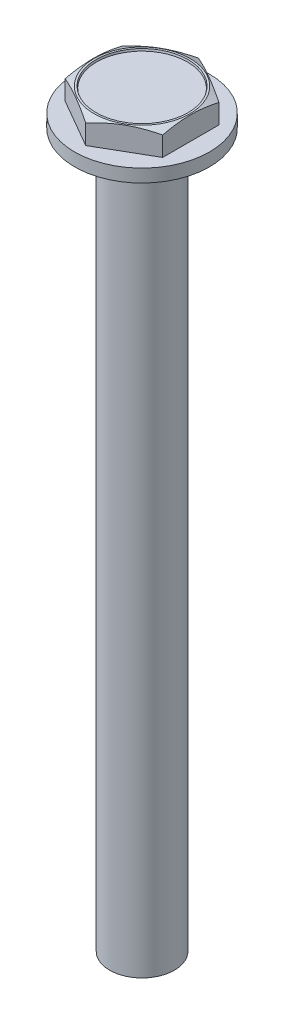
ISO-10303-21;
HEADER;
FILE_DESCRIPTION(('STEP AP214'),'2;1');
FILE_NAME('part.step','',(''),(''),'','','');
FILE_SCHEMA(('AUTOMOTIVE_DESIGN { 1 0 10303 214 1 1 1 1 }'));
ENDSEC;
DATA;
#1=APPLICATION_CONTEXT('core data for automotive mechanical design processes');
#2=APPLICATION_PROTOCOL_DEFINITION('international standard','automotive_design',2000,#1);
#3=PRODUCT_CONTEXT('',#1,'mechanical');
#4=PRODUCT('Part','Part','',(#3));
#5=PRODUCT_RELATED_PRODUCT_CATEGORY('part','',(#4));
#6=PRODUCT_DEFINITION_FORMATION('','',#4);
#7=PRODUCT_DEFINITION_CONTEXT('part definition',#1,'design');
#8=PRODUCT_DEFINITION('design','',#6,#7);
#9=PRODUCT_DEFINITION_SHAPE('','',#8);
#10=(LENGTH_UNIT() NAMED_UNIT(*) SI_UNIT(.MILLI.,.METRE.));
#11=(NAMED_UNIT(*) PLANE_ANGLE_UNIT() SI_UNIT($,.RADIAN.));
#12=(NAMED_UNIT(*) SI_UNIT($,.STERADIAN.) SOLID_ANGLE_UNIT());
#13=UNCERTAINTY_MEASURE_WITH_UNIT(LENGTH_MEASURE(1.E-05),#10,'distance_accuracy_value','');
#14=(GEOMETRIC_REPRESENTATION_CONTEXT(3) GLOBAL_UNCERTAINTY_ASSIGNED_CONTEXT((#13)) GLOBAL_UNIT_ASSIGNED_CONTEXT((#10,
#11,#12)) REPRESENTATION_CONTEXT('',''));
#15=CARTESIAN_POINT('',(0.,0.,0.));
#16=DIRECTION('',(0.,0.,1.));
#17=DIRECTION('',(1.,0.,0.));
#18=AXIS2_PLACEMENT_3D('',#15,#16,#17);
#19=CARTESIAN_POINT('',(0.,0.,0.));
#20=DIRECTION('',(0.,-1.,0.));
#21=DIRECTION('',(0.,0.,-1.));
#22=AXIS2_PLACEMENT_3D('',#19,#20,#21);
#23=CYLINDRICAL_SURFACE('',#22,3.30199714);
#24=CARTESIAN_POINT('',(0.,0.,0.));
#25=DIRECTION('',(0.,-1.,0.));
#26=DIRECTION('',(0.,0.,-1.));
#27=AXIS2_PLACEMENT_3D('',#24,#25,#26);
#28=CIRCLE('',#27,3.30199714);
#29=CARTESIAN_POINT('',(0.,0.,-3.30199714));
#30=VERTEX_POINT('',#29);
#31=EDGE_CURVE('E139',#30,#30,#28,.T.);
#32=ORIENTED_EDGE('',*,*,#31,.F.);
#33=EDGE_LOOP('',(#32));
#34=FACE_BOUND('',#33,.T.);
#35=CARTESIAN_POINT('',(0.,0.63499945,0.));
#36=DIRECTION('',(0.,1.,0.));
#37=DIRECTION('',(0.,0.,1.));
#38=AXIS2_PLACEMENT_3D('',#35,#36,#37);
#39=CIRCLE('',#38,3.30199714);
#40=CARTESIAN_POINT('',(0.,0.63499945,3.30199714));
#41=VERTEX_POINT('',#40);
#42=EDGE_CURVE('E38',#41,#41,#39,.F.);
#43=ORIENTED_EDGE('',*,*,#42,.T.);
#44=EDGE_LOOP('',(#43));
#45=FACE_BOUND('',#44,.T.);
#46=ADVANCED_FACE('F34',(#34,#45),#23,.T.);
#47=CARTESIAN_POINT('',(0.,0.,0.));
#48=DIRECTION('',(0.,-1.,0.));
#49=DIRECTION('',(0.,0.,-1.));
#50=AXIS2_PLACEMENT_3D('',#47,#48,#49);
#51=PLANE('',#50);
#52=CARTESIAN_POINT('',(0.,0.,0.));
#53=DIRECTION('',(0.,-1.,0.));
#54=DIRECTION('',(0.,0.,-1.));
#55=AXIS2_PLACEMENT_3D('',#52,#53,#54);
#56=CIRCLE('',#55,1.587498625);
#57=CARTESIAN_POINT('',(0.,0.,-1.587498625));
#58=VERTEX_POINT('',#57);
#59=EDGE_CURVE('E142',#58,#58,#56,.T.);
#60=ORIENTED_EDGE('',*,*,#59,.F.);
#61=EDGE_LOOP('',(#60));
#62=FACE_BOUND('',#61,.T.);
#63=ORIENTED_EDGE('',*,*,#31,.T.);
#64=EDGE_LOOP('',(#63));
#65=FACE_BOUND('',#64,.T.);
#66=ADVANCED_FACE('F36',(#62,#65),#51,.T.);
#67=CARTESIAN_POINT('',(0.,-34.925,0.));
#68=DIRECTION('',(0.,-1.,0.));
#69=DIRECTION('',(0.,0.,-1.));
#70=AXIS2_PLACEMENT_3D('',#67,#68,#69);
#71=PLANE('',#70);
#72=CARTESIAN_POINT('',(0.,-34.925,0.));
#73=DIRECTION('',(0.,-1.,0.));
#74=DIRECTION('',(0.,0.,-1.));
#75=AXIS2_PLACEMENT_3D('',#72,#73,#74);
#76=CIRCLE('',#75,1.587498625);
#77=CARTESIAN_POINT('',(0.,-34.925,-1.587498625));
#78=VERTEX_POINT('',#77);
#79=EDGE_CURVE('E127',#78,#78,#76,.T.);
#80=ORIENTED_EDGE('',*,*,#79,.T.);
#81=EDGE_LOOP('',(#80));
#82=FACE_BOUND('',#81,.T.);
#83=ADVANCED_FACE('F222',(#82),#71,.T.);
#84=CARTESIAN_POINT('',(0.,0.,0.));
#85=DIRECTION('',(0.,-1.,0.));
#86=DIRECTION('',(0.,0.,-1.));
#87=AXIS2_PLACEMENT_3D('',#84,#85,#86);
#88=CYLINDRICAL_SURFACE('',#87,1.587498625);
#89=ORIENTED_EDGE('',*,*,#59,.T.);
#90=EDGE_LOOP('',(#89));
#91=FACE_BOUND('',#90,.T.);
#92=ORIENTED_EDGE('',*,*,#79,.F.);
#93=EDGE_LOOP('',(#92));
#94=FACE_BOUND('',#93,.T.);
#95=ADVANCED_FACE('F230',(#91,#94),#88,.T.);
#96=CARTESIAN_POINT('',(-3.632196854,0.63499945,3.632196854));
#97=DIRECTION('',(0.,1.,0.));
#98=DIRECTION('',(0.,0.,1.));
#99=AXIS2_PLACEMENT_3D('',#96,#97,#98);
#100=PLANE('',#99);
#101=ORIENTED_EDGE('',*,*,#42,.F.);
#102=EDGE_LOOP('',(#101));
#103=FACE_BOUND('',#102,.T.);
#104=DIRECTION('',(-0.866025781775686,0.,0.499999345299384));
#105=VECTOR('',#104,1.);
#106=CARTESIAN_POINT('',(1.87579371350743E-06,0.63499945,-2.75696049718073));
#107=LINE('',#106,#105);
#108=CARTESIAN_POINT('',(1.87579371350743E-06,0.63499945,-2.75696049718073));
#109=VERTEX_POINT('',#108);
#110=CARTESIAN_POINT('',(-2.38759668147004,0.63499945,-1.37848223407189));
#111=VERTEX_POINT('',#110);
#112=EDGE_CURVE('E92',#109,#111,#107,.T.);
#113=ORIENTED_EDGE('',*,*,#112,.F.);
#114=DIRECTION('',(-0.866025101391085,0.,-0.500000523760287));
#115=VECTOR('',#114,1.);
#116=CARTESIAN_POINT('',(2.38759855726424,0.63499945,-1.37847898510215));
#117=LINE('',#116,#115);
#118=CARTESIAN_POINT('',(2.38759855726424,0.63499945,-1.37847898510215));
#119=VERTEX_POINT('',#118);
#120=EDGE_CURVE('E112',#119,#109,#117,.T.);
#121=ORIENTED_EDGE('',*,*,#120,.F.);
#122=DIRECTION('',(4.53589793386286E-07,0.,-0.999999999999897));
#123=VECTOR('',#122,1.);
#124=CARTESIAN_POINT('',(2.38759730673527,0.63499945,1.37848115108226));
#125=LINE('',#124,#123);
#126=CARTESIAN_POINT('',(2.38759730673527,0.63499945,1.37848115108226));
#127=VERTEX_POINT('',#126);
#128=EDGE_CURVE('E109',#127,#119,#125,.T.);
#129=ORIENTED_EDGE('',*,*,#128,.F.);
#130=DIRECTION('',(0.866025554980997,0.,-0.499999738119788));
#131=VECTOR('',#130,1.);
#132=CARTESIAN_POINT('',(-6.25264571169187E-07,0.63499945,2.7569604971813));
#133=LINE('',#132,#131);
#134=CARTESIAN_POINT('',(-6.25264571455647E-07,0.63499945,2.7569604971813));
#135=VERTEX_POINT('',#134);
#136=EDGE_CURVE('E102',#135,#127,#133,.T.);
#137=ORIENTED_EDGE('',*,*,#136,.F.);
#138=DIRECTION('',(0.86602532818613,0.,0.500000130940089));
#139=VECTOR('',#138,1.);
#140=CARTESIAN_POINT('',(-2.387597932,0.63499945,1.37848006809235));
#141=LINE('',#140,#139);
#142=CARTESIAN_POINT('',(-2.387597932,0.63499945,1.37848006809235));
#143=VERTEX_POINT('',#142);
#144=EDGE_CURVE('E88',#143,#135,#141,.T.);
#145=ORIENTED_EDGE('',*,*,#144,.F.);
#146=DIRECTION('',(-4.53589793478602E-07,0.,0.999999999999897));
#147=VECTOR('',#146,1.);
#148=CARTESIAN_POINT('',(-2.38759668147004,0.63499945,-1.37848223407189));
#149=LINE('',#148,#147);
#150=EDGE_CURVE('E98',#111,#143,#149,.T.);
#151=ORIENTED_EDGE('',*,*,#150,.F.);
#152=EDGE_LOOP('',(#113,#121,#129,#137,#145,#151));
#153=FACE_BOUND('',#152,.T.);
#154=ADVANCED_FACE('F97',(#103,#153),#100,.T.);
#155=CARTESIAN_POINT('',(-2.38759668147004,0.63499945,-1.37848223407189));
#156=DIRECTION('',(-0.999999999999897,0.,-4.53589793478602E-07));
#157=DIRECTION('',(-4.53589793478602E-07,0.,0.999999999999897));
#158=AXIS2_PLACEMENT_3D('',#155,#156,#157);
#159=PLANE('',#158);
#160=DIRECTION('',(0.,1.,0.));
#161=VECTOR('',#160,1.);
#162=CARTESIAN_POINT('',(-2.38759668147004,0.63499945,-1.37848223407189));
#163=LINE('',#162,#161);
#164=CARTESIAN_POINT('',(-2.38759668147004,1.58662449949913,-1.37848223407189));
#165=VERTEX_POINT('',#164);
#166=EDGE_CURVE('E105',#111,#165,#163,.T.);
#167=ORIENTED_EDGE('',*,*,#166,.F.);
#168=ORIENTED_EDGE('',*,*,#150,.T.);
#169=DIRECTION('',(0.,1.,0.));
#170=VECTOR('',#169,1.);
#171=CARTESIAN_POINT('',(-2.387597932,0.63499945,1.37848006809235));
#172=LINE('',#171,#170);
#173=CARTESIAN_POINT('',(-2.387597932,1.58662449949913,1.37848006809235));
#174=VERTEX_POINT('',#173);
#175=EDGE_CURVE('E85',#143,#174,#172,.T.);
#176=ORIENTED_EDGE('',*,*,#175,.T.);
#177=CARTESIAN_POINT('',(-2.38759563665717,0.82592264979571,-3.68191339705671));
#178=CARTESIAN_POINT('',(-2.38759568546214,0.868007597429517,-3.5743162616899));
#179=CARTESIAN_POINT('',(-2.38759573434887,0.909640002661534,-3.46653884254628));
#180=CARTESIAN_POINT('',(-2.3875958323293,0.991743240631232,-3.25052774865804));
#181=CARTESIAN_POINT('',(-2.38759588142302,1.03221392910879,-3.14229401914703));
#182=CARTESIAN_POINT('',(-2.38759598001059,1.11185744720428,-2.92494439563767));
#183=CARTESIAN_POINT('',(-2.38759602950523,1.15102557118968,-2.81582677110998));
#184=CARTESIAN_POINT('',(-2.38759612877967,1.22755881357541,-2.59696285041737));
#185=CARTESIAN_POINT('',(-2.38759617855946,1.26492399306196,-2.48721657569312));
#186=CARTESIAN_POINT('',(-2.3875962778013,1.33690696514371,-2.26842452247645));
#187=CARTESIAN_POINT('',(-2.38759632725889,1.37155447567986,-2.15938857346456));
#188=CARTESIAN_POINT('',(-2.38759642656425,1.43805781322599,-1.94045649993622));
#189=CARTESIAN_POINT('',(-2.38759647641203,1.4699134769258,-1.83056032550962));
#190=CARTESIAN_POINT('',(-2.38759657650195,1.53006082711025,-1.60989856513628));
#191=CARTESIAN_POINT('',(-2.38759662674367,1.55835590678975,-1.49913391545499));
#192=CARTESIAN_POINT('',(-2.38759672769469,1.6105119210806,-1.27657374347072));
#193=CARTESIAN_POINT('',(-2.38759677840395,1.63437327216478,-1.16477831902787));
#194=CARTESIAN_POINT('',(-2.38759689899839,1.68436690936316,-0.898911587805904));
#195=CARTESIAN_POINT('',(-2.38759696909722,1.70812390586332,-0.744369240665296));
#196=CARTESIAN_POINT('',(-2.38759707471041,1.73414034801435,-0.511530696671798));
#197=CARTESIAN_POINT('',(-2.38759710998718,1.74120899454148,-0.433758274471886));
#198=CARTESIAN_POINT('',(-2.38759718064665,1.7519158654777,-0.277979943075556));
#199=CARTESIAN_POINT('',(-2.38759721602932,1.75555444989828,-0.199974059245071));
#200=CARTESIAN_POINT('',(-2.3875972869901,1.75927506300815,-0.0435314223952808));
#201=CARTESIAN_POINT('',(-2.38759732256838,1.75934126407512,0.0349057084680099));
#202=CARTESIAN_POINT('',(-2.3875973936858,1.75587572541089,0.191693659234515));
#203=CARTESIAN_POINT('',(-2.38759742922493,1.75234425093585,0.270044485074635));
#204=CARTESIAN_POINT('',(-2.38759750020373,1.74181206550032,0.426526839189364));
#205=CARTESIAN_POINT('',(-2.38759753564337,1.73481064873104,0.504658319594741));
#206=CARTESIAN_POINT('',(-2.38759760635608,1.71757822791918,0.660554029373964));
#207=CARTESIAN_POINT('',(-2.38759764162914,1.70734734986413,0.738318272954332));
#208=CARTESIAN_POINT('',(-2.38759777439104,1.6632145614196,1.03100981198254));
#209=CARTESIAN_POINT('',(-2.38759787122391,1.61952154135123,1.24449097192338));
#210=CARTESIAN_POINT('',(-2.38759801516718,1.54248199940457,1.56183336117531));
#211=CARTESIAN_POINT('',(-2.38759806296355,1.51486214545272,1.66720691646555));
#212=CARTESIAN_POINT('',(-2.38759815816755,1.45652585719684,1.87709700690655));
#213=CARTESIAN_POINT('',(-2.38759820557521,1.42580963221185,1.98161359947336));
#214=CARTESIAN_POINT('',(-2.38759834783867,1.32960807049972,2.29525260864042));
#215=CARTESIAN_POINT('',(-2.38759844217066,1.26038803903867,2.50322024099262));
#216=CARTESIAN_POINT('',(-2.38759862976457,1.11566696135706,2.91679636358055));
#217=CARTESIAN_POINT('',(-2.387598723027,1.04016911205442,3.12240599463384));
#218=CARTESIAN_POINT('',(-2.38759890923104,0.884641775771132,3.53291795747265));
#219=CARTESIAN_POINT('',(-2.38759900216949,0.804594015180208,3.73781332855943));
#220=CARTESIAN_POINT('',(-2.38759918753323,0.641592906706982,4.14647276155014));
#221=CARTESIAN_POINT('',(-2.38759927995846,0.558639140974642,4.35023665584037));
#222=CARTESIAN_POINT('',(-2.3875994631779,0.391826332829074,4.75416868898633));
#223=CARTESIAN_POINT('',(-2.38759955397728,0.307994707214035,4.95434818767171));
#224=CARTESIAN_POINT('',(-2.38759973526957,0.138862739464773,5.35403153605404));
#225=CARTESIAN_POINT('',(-2.38759982576255,0.0535627437790748,5.55353553218854));
#226=CARTESIAN_POINT('',(-2.38759991615683,-0.0322324060214044,5.75282195545422));
#227=B_SPLINE_CURVE_WITH_KNOTS('',3,(#177,#178,#179,#180,#181,#182,#183,#184,#185,#186,#187,
#188,#189,#190,#191,#192,#193,#194,#195,#196,#197,#198,#199,#200,#201,#202,#203,#204,#205,#206,
#207,#208,#209,#210,#211,#212,#213,#214,#215,#216,#217,#218,#219,#220,#221,#222,#223,#224,#225,
#226),.UNSPECIFIED.,.F.,.F.,(4,2,2,2,2,2,2,2,2,2,2,2,2,2,2,2,2,2,2,2,2,2,2,2,4),(0.,
0.346607897833493,0.693258652299566,1.04104935984361,1.38882827547449,1.73202382477045,
2.07523943604303,2.4181254491265,2.76097923764438,3.22954472428704,3.46376008296962,
3.69795085620414,3.93317913851899,4.16839007873801,4.40364888203637,4.63889850856751,
5.29155455526913,5.61833976804775,5.94510290448223,6.60247648387668,7.25951732856589,
7.91941453657583,8.57940702283087,9.23047341215962,9.88138823841751),.UNSPECIFIED.);
#228=EDGE_CURVE('E11',#165,#174,#227,.T.);
#229=ORIENTED_EDGE('',*,*,#228,.F.);
#230=EDGE_LOOP('',(#167,#168,#176,#229));
#231=FACE_BOUND('',#230,.T.);
#232=ADVANCED_FACE('F104',(#231),#159,.T.);
#233=CARTESIAN_POINT('',(1.87579371350743E-06,0.63499945,-2.75696049718073));
#234=DIRECTION('',(-0.499999345299384,0.,-0.866025781775686));
#235=DIRECTION('',(-0.866025781775686,0.,0.499999345299384));
#236=AXIS2_PLACEMENT_3D('',#233,#234,#235);
#237=PLANE('',#236);
#238=DIRECTION('',(0.,1.,0.));
#239=VECTOR('',#238,1.);
#240=CARTESIAN_POINT('',(1.87579371350743E-06,0.63499945,-2.75696049718073));
#241=LINE('',#240,#239);
#242=CARTESIAN_POINT('',(1.87579371350743E-06,1.58662449949913,-2.75696049718073));
#243=VERTEX_POINT('',#242);
#244=EDGE_CURVE('E117',#109,#243,#241,.T.);
#245=ORIENTED_EDGE('',*,*,#244,.F.);
#246=ORIENTED_EDGE('',*,*,#112,.T.);
#247=ORIENTED_EDGE('',*,*,#166,.T.);
#248=CARTESIAN_POINT('',(0.000201875793713451,1.58657065158552,-2.75707596703298));
#249=CARTESIAN_POINT('',(-0.0720066957215331,1.60601236066919,-2.71538640161542));
#250=CARTESIAN_POINT('',(-0.144481711809998,1.62420572203027,-2.67354300462036));
#251=CARTESIAN_POINT('',(-0.289975655389969,1.65766237612313,-2.58954218378354));
#252=CARTESIAN_POINT('',(-0.362994855127122,1.67292408342063,-2.54738460276095));
#253=CARTESIAN_POINT('',(-0.509578901999248,1.70007484817584,-2.46275441159375));
#254=CARTESIAN_POINT('',(-0.583144196375563,1.71196073140966,-2.42028154323469));
#255=CARTESIAN_POINT('',(-0.73065200191862,1.73192108675075,-2.33511802068129));
#256=CARTESIAN_POINT('',(-0.804594439774827,1.73999627304312,-2.29242740881274));
#257=CARTESIAN_POINT('',(-0.951197719183179,1.75188911899834,-2.20778611375496));
#258=CARTESIAN_POINT('',(-1.02385333963283,1.75579159580006,-2.1658384449654));
#259=CARTESIAN_POINT('',(-1.16924844741729,1.7594692707652,-2.0818946869021));
#260=CARTESIAN_POINT('',(-1.24198793948803,1.75924422317287,-2.03989859489406));
#261=CARTESIAN_POINT('',(-1.38729615050964,1.75467833848675,-1.95600500661259));
#262=CARTESIAN_POINT('',(-1.45986496726674,1.75034158131286,-1.91410745387079));
#263=CARTESIAN_POINT('',(-1.60474605864116,1.73773860060795,-1.83046046280208));
#264=CARTESIAN_POINT('',(-1.67705832618673,1.72947226959368,-1.78871102855803));
#265=CARTESIAN_POINT('',(-1.80267576563598,1.7119279729979,-1.71618589269656));
#266=CARTESIAN_POINT('',(-1.85606796506129,1.70346223157425,-1.68535994580384));
#267=CARTESIAN_POINT('',(-1.96260822142988,1.68470190826843,-1.62384900750002));
#268=CARTESIAN_POINT('',(-2.01575628840245,1.67440740221637,-1.59316401029851));
#269=CARTESIAN_POINT('',(-2.12221905586089,1.65206814140025,-1.53169781015972));
#270=CARTESIAN_POINT('',(-2.17553161334615,1.6400098720831,-1.50091784448225));
#271=CARTESIAN_POINT('',(-2.28187473587065,1.61438127027717,-1.43952072125767));
#272=CARTESIAN_POINT('',(-2.3349053466602,1.60081119146804,-1.40890353729666));
#273=CARTESIAN_POINT('',(-2.38779668147004,1.58657065158552,-1.37836676421964));
#274=B_SPLINE_CURVE_WITH_KNOTS('',3,(#248,#249,#250,#251,#252,#253,#254,#255,#256,#257,#258,
#259,#260,#261,#262,#263,#264,#265,#266,#267,#268,#269,#270,#271,#272,#273),.UNSPECIFIED.,.F.,
.F.,(4,2,2,2,2,2,2,2,2,2,2,2,4),(0.,0.256862209525977,0.513862941083679,0.771104531568585,
1.02829789172992,1.28015774621717,1.53203259666787,1.78365778091964,2.03528984811856,
2.22195401160986,2.40861043683876,2.59678030701215,2.78491864994954),.UNSPECIFIED.);
#275=EDGE_CURVE('E43',#243,#165,#274,.T.);
#276=ORIENTED_EDGE('',*,*,#275,.F.);
#277=EDGE_LOOP('',(#245,#246,#247,#276));
#278=FACE_BOUND('',#277,.T.);
#279=ADVANCED_FACE('F172',(#278),#237,.T.);
#280=CARTESIAN_POINT('',(2.38759855726424,0.63499945,-1.37847898510215));
#281=DIRECTION('',(0.500000523760287,0.,-0.866025101391084));
#282=DIRECTION('',(-0.866025101391085,0.,-0.500000523760287));
#283=AXIS2_PLACEMENT_3D('',#280,#281,#282);
#284=PLANE('',#283);
#285=DIRECTION('',(0.,1.,0.));
#286=VECTOR('',#285,1.);
#287=CARTESIAN_POINT('',(2.38759855726424,0.63499945,-1.37847898510215));
#288=LINE('',#287,#286);
#289=CARTESIAN_POINT('',(2.38759855726424,1.58662449949913,-1.37847898510215));
#290=VERTEX_POINT('',#289);
#291=EDGE_CURVE('E120',#119,#290,#288,.T.);
#292=ORIENTED_EDGE('',*,*,#291,.F.);
#293=ORIENTED_EDGE('',*,*,#120,.T.);
#294=ORIENTED_EDGE('',*,*,#244,.T.);
#295=CARTESIAN_POINT('',(2.38779855726424,1.58657065154321,-1.37836351488704));
#296=CARTESIAN_POINT('',(2.31559004247528,1.60601236062979,-1.42005317856589));
#297=CARTESIAN_POINT('',(2.24311508332241,1.62420572199378,-1.46189667418482));
#298=CARTESIAN_POINT('',(2.09762125404086,1.65766237609246,-1.54589769300958));
#299=CARTESIAN_POINT('',(2.02460211166675,1.67292408339284,-1.58805537339659));
#300=CARTESIAN_POINT('',(1.87801817994925,1.70007484815373,-1.67268576403523));
#301=CARTESIAN_POINT('',(1.80445294336486,1.71196073139035,-1.71515873250192));
#302=CARTESIAN_POINT('',(1.65694525370191,1.73192108673679,-1.80032245578393));
#303=CARTESIAN_POINT('',(1.58300287393383,1.73999627303172,-1.84301316827337));
#304=CARTESIAN_POINT('',(1.43639970969507,1.75188911899167,-1.92765466282884));
#305=CARTESIAN_POINT('',(1.36374414632279,1.75579159579557,-1.9696024304881));
#306=CARTESIAN_POINT('',(1.21834915275887,1.75946927076465,-2.05354638640497));
#307=CARTESIAN_POINT('',(1.1456097178313,1.7592442231741,-2.09554257739689));
#308=CARTESIAN_POINT('',(1.00030162096183,1.75467833849104,-2.17943636341376));
#309=CARTESIAN_POINT('',(0.927732861213782,1.75034158131844,-2.22133401490721));
#310=CARTESIAN_POINT('',(0.782851883655894,1.73773860061561,-2.30498120313014));
#311=CARTESIAN_POINT('',(0.710539672917795,1.72947226960212,-2.34673073577676));
#312=CARTESIAN_POINT('',(0.584922332136081,1.71192797300508,-2.41925604258754));
#313=CARTESIAN_POINT('',(0.531530174639281,1.70346223157892,-2.45008206214542));
#314=CARTESIAN_POINT('',(0.424990001936059,1.6847019082668,-2.51159314544722));
#315=CARTESIAN_POINT('',(0.371841976700345,1.67440740221095,-2.54227821498158));
#316=CARTESIAN_POINT('',(0.265379292846402,1.65206814138607,-2.60374456001291));
#317=CARTESIAN_POINT('',(0.212066777227084,1.64000987206394,-2.63452459824716));
#318=CARTESIAN_POINT('',(0.105723738213136,1.6143812702471,-2.69592186620143));
#319=CARTESIAN_POINT('',(0.0526931690682303,1.60081119143204,-2.72653912233543));
#320=CARTESIAN_POINT('',(-0.000198124206286413,1.58657065154322,-2.75707596739585));
#321=B_SPLINE_CURVE_WITH_KNOTS('',3,(#295,#296,#297,#298,#299,#300,#301,#302,#303,#304,#305,
#306,#307,#308,#309,#310,#311,#312,#313,#314,#315,#316,#317,#318,#319,#320),.UNSPECIFIED.,.F.,
.F.,(4,2,2,2,2,2,2,2,2,2,2,2,4),(0.,0.256862209540332,0.513862941112421,0.771104531611923,
1.02829789178785,1.28015774628854,1.53203259675269,1.78365778101781,2.0352898482301,
2.22195401178604,2.40861043707962,2.5967803073189,2.7849186503221),.UNSPECIFIED.);
#322=EDGE_CURVE('E186',#290,#243,#321,.T.);
#323=ORIENTED_EDGE('',*,*,#322,.F.);
#324=EDGE_LOOP('',(#292,#293,#294,#323));
#325=FACE_BOUND('',#324,.T.);
#326=ADVANCED_FACE('F194',(#325),#284,.T.);
#327=CARTESIAN_POINT('',(2.38759730673527,0.63499945,1.37848115108226));
#328=DIRECTION('',(0.999999999999897,0.,4.53589793386286E-07));
#329=DIRECTION('',(4.53589793386286E-07,0.,-0.999999999999897));
#330=AXIS2_PLACEMENT_3D('',#327,#328,#329);
#331=PLANE('',#330);
#332=DIRECTION('',(0.,1.,0.));
#333=VECTOR('',#332,1.);
#334=CARTESIAN_POINT('',(2.38759730673527,0.63499945,1.37848115108226));
#335=LINE('',#334,#333);
#336=CARTESIAN_POINT('',(2.38759730673527,1.58662449949913,1.37848115108226));
#337=VERTEX_POINT('',#336);
#338=EDGE_CURVE('E123',#127,#337,#335,.T.);
#339=ORIENTED_EDGE('',*,*,#338,.F.);
#340=ORIENTED_EDGE('',*,*,#128,.T.);
#341=ORIENTED_EDGE('',*,*,#291,.T.);
#342=CARTESIAN_POINT('',(2.38759960207737,0.825922691555756,-3.68191071887759));
#343=CARTESIAN_POINT('',(2.3875995532724,0.868007639183852,-3.57431357072815));
#344=CARTESIAN_POINT('',(2.38759950438566,0.90964004402419,-3.46653613866673));
#345=CARTESIAN_POINT('',(2.38759940640522,0.991743280208127,-3.25052501860314));
#346=CARTESIAN_POINT('',(2.3875993573115,1.03221396729128,-3.14229127583448));
#347=CARTESIAN_POINT('',(2.38759925872391,1.1118574815445,-2.9249416248485));
#348=CARTESIAN_POINT('',(2.38759920922927,1.1510256030707,-2.81582398609797));
#349=CARTESIAN_POINT('',(2.38759910995481,1.22755883893914,-2.59696003653877));
#350=CARTESIAN_POINT('',(2.38759906017502,1.26492401436774,-2.48721374717082));
#351=CARTESIAN_POINT('',(2.38759896093316,1.33690697592617,-2.26842166585009));
#352=CARTESIAN_POINT('',(2.38759891147556,1.37155448005253,-2.15938570339355));
#353=CARTESIAN_POINT('',(2.38759881217019,1.43805780246344,-1.94045360255862));
#354=CARTESIAN_POINT('',(2.38759876232241,1.46991345743758,-1.83055741426999));
#355=CARTESIAN_POINT('',(2.38759866223247,1.53006078733915,-1.609895626135));
#356=CARTESIAN_POINT('',(2.38759861199075,1.55835585547264,-1.49913096255676));
#357=CARTESIAN_POINT('',(2.38759851103971,1.61051184359209,-1.27657076270916));
#358=CARTESIAN_POINT('',(2.38759846033044,1.63437318005147,-1.16477532430001));
#359=CARTESIAN_POINT('',(2.387598339736,1.68436677772841,-0.89890856653366));
#360=CARTESIAN_POINT('',(2.38759826963716,1.70812374836471,-0.744366207029769));
#361=CARTESIAN_POINT('',(2.38759816402396,1.73414014944534,-0.511527645989468));
#362=CARTESIAN_POINT('',(2.38759812874719,1.7412087819066,-0.433755218316809));
#363=CARTESIAN_POINT('',(2.38759805808772,1.75191562444902,-0.277976876594105));
#364=CARTESIAN_POINT('',(2.38759802270504,1.75555419454137,-0.199970987909903));
#365=CARTESIAN_POINT('',(2.38759795174426,1.75927477920522,-0.0435283420189672));
#366=CARTESIAN_POINT('',(2.38759791616597,1.75934096615644,0.034908793028763));
#367=CARTESIAN_POINT('',(2.38759784504856,1.7558754000747,0.191696751558127));
#368=CARTESIAN_POINT('',(2.38759780950942,1.75234391229746,0.270047580976703));
#369=CARTESIAN_POINT('',(2.38759773853062,1.74181170147596,0.426529941822225));
#370=CARTESIAN_POINT('',(2.38759770309097,1.73481027262104,0.504661425379699));
#371=CARTESIAN_POINT('',(2.38759763237827,1.71757782907657,0.660557141191597));
#372=CARTESIAN_POINT('',(2.3875975971052,1.70734694037353,0.738321387652445));
#373=CARTESIAN_POINT('',(2.38759746434338,1.66321414027107,1.03101276716129));
#374=CARTESIAN_POINT('',(2.38759736751058,1.61952114209703,1.24449376686826));
#375=CARTESIAN_POINT('',(2.38759722356741,1.5424816536781,1.56183592095007));
#376=CARTESIAN_POINT('',(2.38759717577108,1.51486182110949,1.66720939844094));
#377=CARTESIAN_POINT('',(2.38759708056715,1.45652558050276,1.87709933469879));
#378=CARTESIAN_POINT('',(2.38759703315952,1.42580938178266,1.98161585088154));
#379=CARTESIAN_POINT('',(2.38759689089617,1.32960790508505,2.29525462849379));
#380=CARTESIAN_POINT('',(2.38759679656425,1.26038793750737,2.50322210745805));
#381=CARTESIAN_POINT('',(2.38759660897048,1.11566699328491,2.91679792625402));
#382=CARTESIAN_POINT('',(2.38759651570811,1.04016921354431,3.12240740689817));
#383=CARTESIAN_POINT('',(2.38759632950422,0.884642022464377,3.53291906091661));
#384=CARTESIAN_POINT('',(2.38759623656584,0.804594337702559,3.73781427366494));
#385=CARTESIAN_POINT('',(2.38759605120224,0.641593382092469,4.14647339051832));
#386=CARTESIAN_POINT('',(2.38759595877709,0.558639693395677,4.35023712701029));
#387=CARTESIAN_POINT('',(2.38759577555778,0.391827036139811,4.75416885303008));
#388=CARTESIAN_POINT('',(2.38759568475847,0.307995484313934,4.954348202359));
#389=CARTESIAN_POINT('',(2.38759550346632,0.138863664058844,5.35403125221361));
#390=CARTESIAN_POINT('',(2.38759541297341,0.0535637420775322,5.55353509917657));
#391=CARTESIAN_POINT('',(2.38759532257919,-0.0322313341687546,5.75282137322842));
#392=B_SPLINE_CURVE_WITH_KNOTS('',3,(#342,#343,#344,#345,#346,#347,#348,#349,#350,#351,#352,
#353,#354,#355,#356,#357,#358,#359,#360,#361,#362,#363,#364,#365,#366,#367,#368,#369,#370,#371,
#372,#373,#374,#375,#376,#377,#378,#379,#380,#381,#382,#383,#384,#385,#386,#387,#388,#389,#390,
#391),.UNSPECIFIED.,.F.,.F.,(4,2,2,2,2,2,2,2,2,2,2,2,2,2,2,2,2,2,2,2,2,2,2,2,4),(0.,
0.346607933546298,0.693258723789544,1.04104946898029,1.38882842224291,1.73202400411018,
2.07523964796885,2.41812569277514,2.76097951298964,3.22954502419769,3.4637603954037,
3.69795118118392,3.93317947604722,4.16839042883754,4.40364924485356,4.63889888417201,
5.29155445024391,5.61833942098221,5.94510231546487,6.60247539800709,7.2595157472167,
7.91941243001134,8.57940439066715,9.23047028119061,9.88138460903514),.UNSPECIFIED.);
#393=EDGE_CURVE('E203',#337,#290,#392,.F.);
#394=ORIENTED_EDGE('',*,*,#393,.F.);
#395=EDGE_LOOP('',(#339,#340,#341,#394));
#396=FACE_BOUND('',#395,.T.);
#397=ADVANCED_FACE('F198',(#396),#331,.T.);
#398=CARTESIAN_POINT('',(-6.25264571169187E-07,0.63499945,2.7569604971813));
#399=DIRECTION('',(0.499999738119788,0.,0.866025554980997));
#400=DIRECTION('',(0.866025554980997,0.,-0.499999738119788));
#401=AXIS2_PLACEMENT_3D('',#398,#399,#400);
#402=PLANE('',#401);
#403=DIRECTION('',(0.,1.,0.));
#404=VECTOR('',#403,1.);
#405=CARTESIAN_POINT('',(-6.25264571169187E-07,0.63499945,2.7569604971813));
#406=LINE('',#405,#404);
#407=CARTESIAN_POINT('',(-6.25264571021955E-07,1.58662449949913,2.7569604971813));
#408=VERTEX_POINT('',#407);
#409=EDGE_CURVE('E50',#135,#408,#406,.T.);
#410=ORIENTED_EDGE('',*,*,#409,.F.);
#411=ORIENTED_EDGE('',*,*,#136,.T.);
#412=ORIENTED_EDGE('',*,*,#338,.T.);
#413=CARTESIAN_POINT('',(-0.00020062526457123,1.58657065157142,2.7570759671545));
#414=CARTESIAN_POINT('',(0.0720079273419291,1.60601236065606,2.71538636898317));
#415=CARTESIAN_POINT('',(0.144482924451879,1.62420572201811,2.67354293911348));
#416=CARTESIAN_POINT('',(0.289976829932406,1.65766237611291,2.58954205228066));
#417=CARTESIAN_POINT('',(0.36299601054856,1.67292408341136,2.54738443813659));
#418=CARTESIAN_POINT('',(0.509580019035841,1.70007484816847,2.46275418047889));
#419=CARTESIAN_POINT('',(0.583145294148195,1.71196073140323,2.42028127875061));
#420=CARTESIAN_POINT('',(0.730653061064579,1.7319210867461,2.33511768928766));
#421=CARTESIAN_POINT('',(0.804595479558093,1.73999627303932,2.29242704387881));
#422=CARTESIAN_POINT('',(0.95119872057661,1.75188911899612,2.20778568232178));
#423=CARTESIAN_POINT('',(1.02385432200049,1.75579159579857,2.16583798057564));
#424=CARTESIAN_POINT('',(1.16924939171146,1.75946927076501,2.08189415656113));
#425=CARTESIAN_POINT('',(1.2419888647345,1.75924422317328,2.03989803155846));
#426=CARTESIAN_POINT('',(1.38729703770542,1.75467833848818,1.95600437736517));
#427=CARTESIAN_POINT('',(1.45986583545952,1.75034158131472,1.91410679170615));
#428=CARTESIAN_POINT('',(1.60474688889512,1.7377386006105,1.83045973491934));
#429=CARTESIAN_POINT('',(1.67705913750488,1.72947226959649,1.78871026787443));
#430=CARTESIAN_POINT('',(1.80267654406499,1.71192797300029,1.71618507502984));
#431=CARTESIAN_POINT('',(1.85606872951413,1.7034622315758,1.6853591039154));
#432=CARTESIAN_POINT('',(1.96260895799429,1.68470190826789,1.6238481172789));
#433=CARTESIAN_POINT('',(2.01575701105459,1.67440740221456,1.59316309596644));
#434=CARTESIAN_POINT('',(2.12221975064488,1.65206814139552,1.53169684753012));
#435=CARTESIAN_POINT('',(2.17553229417484,1.64000987207671,1.50091685766705));
#436=CARTESIAN_POINT('',(2.28187538886251,1.61438127026714,1.43951968619923));
#437=CARTESIAN_POINT('',(2.33490598577052,1.60081119145604,1.40890247818055));
#438=CARTESIAN_POINT('',(2.38779730673527,1.58657065157142,1.37836568110906));
#439=B_SPLINE_CURVE_WITH_KNOTS('',3,(#413,#414,#415,#416,#417,#418,#419,#420,#421,#422,#423,
#424,#425,#426,#427,#428,#429,#430,#431,#432,#433,#434,#435,#436,#437,#438),.UNSPECIFIED.,.F.,
.F.,(4,2,2,2,2,2,2,2,2,2,2,2,4),(0.,0.256862209530763,0.51386294109326,0.771104531583032,
1.02829789174923,1.28015774624096,1.53203259669614,1.78365778095236,2.03528984815574,
2.22195401166858,2.40861043691905,2.5967803071144,2.78491865007373),.UNSPECIFIED.);
#440=EDGE_CURVE('E152',#408,#337,#439,.T.);
#441=ORIENTED_EDGE('',*,*,#440,.F.);
#442=EDGE_LOOP('',(#410,#411,#412,#441));
#443=FACE_BOUND('',#442,.T.);
#444=ADVANCED_FACE('F166',(#443),#402,.T.);
#445=CARTESIAN_POINT('',(-2.387597932,0.63499945,1.37848006809235));
#446=DIRECTION('',(-0.500000130940089,0.,0.86602532818613));
#447=DIRECTION('',(0.86602532818613,0.,0.500000130940089));
#448=AXIS2_PLACEMENT_3D('',#445,#446,#447);
#449=PLANE('',#448);
#450=ORIENTED_EDGE('',*,*,#175,.F.);
#451=ORIENTED_EDGE('',*,*,#144,.T.);
#452=ORIENTED_EDGE('',*,*,#409,.T.);
#453=CARTESIAN_POINT('',(-2.387797932,1.58657065155732,1.37836459799819));
#454=CARTESIAN_POINT('',(-2.31558939830226,1.60601236064292,1.42005422892328));
#455=CARTESIAN_POINT('',(-2.24311442017084,1.62420572200595,1.4618976916676));
#456=CARTESIAN_POINT('',(-2.09762055278979,1.65766237610268,1.5458986444964));
#457=CARTESIAN_POINT('',(-2.02460139129465,1.6729240834021,1.58805629176195));
#458=CARTESIAN_POINT('',(-1.87801742119224,1.7000748481611,1.67268661591012));
#459=CARTESIAN_POINT('',(-1.80445216534387,1.71196073139679,1.71515955100761));
#460=CARTESIAN_POINT('',(-1.65694443705419,1.73192108674145,1.8003232073801));
#461=CARTESIAN_POINT('',(-1.58300203792338,1.73999627303552,1.84301388632925));
#462=CARTESIAN_POINT('',(-1.43639883529473,1.75188911899389,1.92765531438551));
#463=CARTESIAN_POINT('',(-1.36374325289664,1.75579159579707,1.96960304908821));
#464=CARTESIAN_POINT('',(-1.21834822125918,1.75946927076483,2.05354693905391));
#465=CARTESIAN_POINT('',(-1.14560876728386,1.75924422317369,2.09554309705121));
#466=CARTESIAN_POINT('',(-1.00030063236366,1.75467833848961,2.1794368171563));
#467=CARTESIAN_POINT('',(-0.927731853612573,1.75034158131658,2.22133443573254));
#468=CARTESIAN_POINT('',(-0.782850838115813,1.73773860061305,2.30498155823742));
#469=CARTESIAN_POINT('',(-0.710538608441876,1.7294722695993,2.34673105808318));
#470=CARTESIAN_POINT('',(-0.584921234770956,1.71192797300269,2.41925630791088));
#471=CARTESIAN_POINT('',(-0.531529063297976,1.70346223157736,2.45008230324704));
#472=CARTESIAN_POINT('',(-0.424988862706277,1.68470190826734,2.5115933382162));
#473=CARTESIAN_POINT('',(-0.371840823558264,1.67440740221275,2.54227838363961));
#474=CARTESIAN_POINT('',(-0.265378111836136,1.6520681413908,2.60374468037344));
#475=CARTESIAN_POINT('',(-0.212065582261493,1.64000987207033,2.63452469442211));
#476=CARTESIAN_POINT('',(-0.105722515410672,1.61438127025712,2.69592191413316));
#477=CARTESIAN_POINT('',(-0.0526919323842065,1.60081119144404,2.7265391462095));
#478=CARTESIAN_POINT('',(0.000199374735428924,1.58657065155732,2.75707596727546));
#479=B_SPLINE_CURVE_WITH_KNOTS('',3,(#453,#454,#455,#456,#457,#458,#459,#460,#461,#462,#463,
#464,#465,#466,#467,#468,#469,#470,#471,#472,#473,#474,#475,#476,#477,#478),.UNSPECIFIED.,.F.,
.F.,(4,2,2,2,2,2,2,2,2,2,2,2,4),(0.,0.256862209535547,0.51386294110284,0.771104531597477,
1.02829789176854,1.28015774626475,1.53203259672442,1.78365778098509,2.03528984819292,
2.22195401172731,2.40861043699934,2.59678030721665,2.78491865019792),.UNSPECIFIED.);
#480=EDGE_CURVE('E90',#174,#408,#479,.T.);
#481=ORIENTED_EDGE('',*,*,#480,.F.);
#482=EDGE_LOOP('',(#450,#451,#452,#481));
#483=FACE_BOUND('',#482,.T.);
#484=ADVANCED_FACE('F87',(#483),#449,.T.);
#485=CARTESIAN_POINT('',(2.22922976463086,1.68413615412081,0.));
#486=DIRECTION('',(0.,1.,0.));
#487=DIRECTION('',(0.,0.,1.));
#488=AXIS2_PLACEMENT_3D('',#485,#486,#487);
#489=PLANE('',#488);
#490=CARTESIAN_POINT('',(0.,1.68413615412081,0.));
#491=DIRECTION('',(0.,-1.,0.));
#492=DIRECTION('',(0.,0.,-1.));
#493=AXIS2_PLACEMENT_3D('',#490,#491,#492);
#494=CIRCLE('',#493,2.22922976463086);
#495=CARTESIAN_POINT('',(0.,1.68413615412081,-2.22922976463086));
#496=VERTEX_POINT('',#495);
#497=EDGE_CURVE('E130',#496,#496,#494,.T.);
#498=ORIENTED_EDGE('',*,*,#497,.F.);
#499=EDGE_LOOP('',(#498));
#500=FACE_BOUND('',#499,.T.);
#501=ADVANCED_FACE('F165',(#500),#489,.T.);
#502=CARTESIAN_POINT('',(0.,1.77799846,0.));
#503=DIRECTION('',(0.,1.,0.));
#504=DIRECTION('',(0.,0.,1.));
#505=AXIS2_PLACEMENT_3D('',#502,#503,#504);
#506=CONICAL_SURFACE('',#505,2.25269534110065,0.244978663126864);
#507=ORIENTED_EDGE('',*,*,#497,.T.);
#508=EDGE_LOOP('',(#507));
#509=FACE_BOUND('',#508,.T.);
#510=CARTESIAN_POINT('',(0.,1.77799846,0.));
#511=DIRECTION('',(0.,-1.,0.));
#512=DIRECTION('',(0.,0.,-1.));
#513=AXIS2_PLACEMENT_3D('',#510,#511,#512);
#514=CIRCLE('',#513,2.25269534110065);
#515=CARTESIAN_POINT('',(0.,1.77799846,-2.25269534110065));
#516=VERTEX_POINT('',#515);
#517=EDGE_CURVE('E133',#516,#516,#514,.T.);
#518=ORIENTED_EDGE('',*,*,#517,.F.);
#519=EDGE_LOOP('',(#518));
#520=FACE_BOUND('',#519,.T.);
#521=ADVANCED_FACE('F244',(#509,#520),#506,.F.);
#522=CARTESIAN_POINT('',(2.34655764697985,1.77799846,0.));
#523=DIRECTION('',(0.,1.,0.));
#524=DIRECTION('',(0.,0.,1.));
#525=AXIS2_PLACEMENT_3D('',#522,#523,#524);
#526=PLANE('',#525);
#527=ORIENTED_EDGE('',*,*,#517,.T.);
#528=EDGE_LOOP('',(#527));
#529=FACE_BOUND('',#528,.T.);
#530=CARTESIAN_POINT('',(0.,1.77799846,0.));
#531=DIRECTION('',(0.,-1.,0.));
#532=DIRECTION('',(0.,0.,-1.));
#533=AXIS2_PLACEMENT_3D('',#530,#531,#532);
#534=CIRCLE('',#533,2.34655764697985);
#535=CARTESIAN_POINT('',(0.,1.77799846,-2.34655764697985));
#536=VERTEX_POINT('',#535);
#537=EDGE_CURVE('E136',#536,#536,#534,.T.);
#538=ORIENTED_EDGE('',*,*,#537,.F.);
#539=EDGE_LOOP('',(#538));
#540=FACE_BOUND('',#539,.T.);
#541=ADVANCED_FACE('F247',(#529,#540),#526,.T.);
#542=CARTESIAN_POINT('',(0.,1.33246978078048,0.));
#543=DIRECTION('',(0.,-1.,0.));
#544=DIRECTION('',(0.,0.,-1.));
#545=AXIS2_PLACEMENT_3D('',#542,#543,#544);
#546=CONICAL_SURFACE('',#545,3.30199714,1.1344640767949);
#547=ORIENTED_EDGE('',*,*,#537,.T.);
#548=EDGE_LOOP('',(#547));
#549=FACE_BOUND('',#548,.T.);
#550=ORIENTED_EDGE('',*,*,#275,.T.);
#551=ORIENTED_EDGE('',*,*,#228,.T.);
#552=ORIENTED_EDGE('',*,*,#480,.T.);
#553=ORIENTED_EDGE('',*,*,#440,.T.);
#554=ORIENTED_EDGE('',*,*,#393,.T.);
#555=ORIENTED_EDGE('',*,*,#322,.T.);
#556=EDGE_LOOP('',(#550,#551,#552,#553,#554,#555));
#557=FACE_BOUND('',#556,.T.);
#558=ADVANCED_FACE('F159',(#549,#557),#546,.T.);
#559=CLOSED_SHELL('',(#46,#66,#83,#95,#154,#232,#279,#326,#397,#444,#484,#501,#521,#541,#558));
#560=MANIFOLD_SOLID_BREP('B2',#559);
#561=ADVANCED_BREP_SHAPE_REPRESENTATION('',(#18,#560),#14);
#562=SHAPE_DEFINITION_REPRESENTATION(#9,#561);
ENDSEC;
END-ISO-10303-21;
